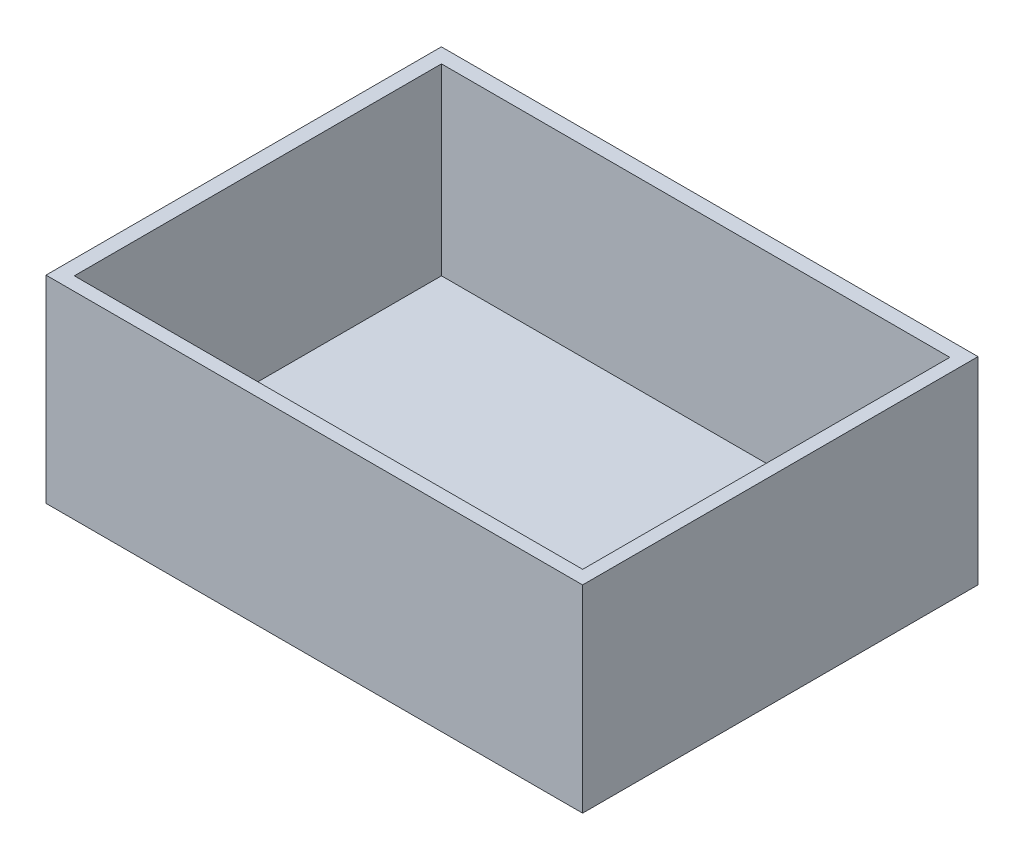
ISO-10303-21;
HEADER;
FILE_DESCRIPTION(('STEP AP214'),'2;1');
FILE_NAME('part.step','',(''),(''),'','','');
FILE_SCHEMA(('AUTOMOTIVE_DESIGN { 1 0 10303 214 1 1 1 1 }'));
ENDSEC;
DATA;
#1=APPLICATION_CONTEXT('core data for automotive mechanical design processes');
#2=APPLICATION_PROTOCOL_DEFINITION('international standard','automotive_design',2000,#1);
#3=PRODUCT_CONTEXT('',#1,'mechanical');
#4=PRODUCT('Part','Part','',(#3));
#5=PRODUCT_RELATED_PRODUCT_CATEGORY('part','',(#4));
#6=PRODUCT_DEFINITION_FORMATION('','',#4);
#7=PRODUCT_DEFINITION_CONTEXT('part definition',#1,'design');
#8=PRODUCT_DEFINITION('design','',#6,#7);
#9=PRODUCT_DEFINITION_SHAPE('','',#8);
#10=(LENGTH_UNIT() NAMED_UNIT(*) SI_UNIT(.MILLI.,.METRE.));
#11=(NAMED_UNIT(*) PLANE_ANGLE_UNIT() SI_UNIT($,.RADIAN.));
#12=(NAMED_UNIT(*) SI_UNIT($,.STERADIAN.) SOLID_ANGLE_UNIT());
#13=UNCERTAINTY_MEASURE_WITH_UNIT(LENGTH_MEASURE(1.E-05),#10,'distance_accuracy_value','');
#14=(GEOMETRIC_REPRESENTATION_CONTEXT(3) GLOBAL_UNCERTAINTY_ASSIGNED_CONTEXT((#13)) GLOBAL_UNIT_ASSIGNED_CONTEXT((#10,
#11,#12)) REPRESENTATION_CONTEXT('',''));
#15=CARTESIAN_POINT('',(0.,0.,0.));
#16=DIRECTION('',(0.,0.,1.));
#17=DIRECTION('',(1.,0.,0.));
#18=AXIS2_PLACEMENT_3D('',#15,#16,#17);
#19=CARTESIAN_POINT('',(-61.7894736842105,70.,-61.8947368421053));
#20=DIRECTION('',(1.,0.,0.));
#21=DIRECTION('',(0.,0.,-1.));
#22=AXIS2_PLACEMENT_3D('',#19,#20,#21);
#23=PLANE('',#22);
#24=DIRECTION('',(0.,0.,1.));
#25=VECTOR('',#24,1.);
#26=CARTESIAN_POINT('',(-61.7894736842105,0.,-61.8947368421053));
#27=LINE('',#26,#25);
#28=CARTESIAN_POINT('',(-61.7894736842105,0.,-61.8947368421053));
#29=VERTEX_POINT('',#28);
#30=CARTESIAN_POINT('',(-61.7894736842105,0.,78.1052631578947));
#31=VERTEX_POINT('',#30);
#32=EDGE_CURVE('E145',#29,#31,#27,.T.);
#33=ORIENTED_EDGE('',*,*,#32,.T.);
#34=DIRECTION('',(0.,-1.,0.));
#35=VECTOR('',#34,1.);
#36=CARTESIAN_POINT('',(-61.7894736842105,70.,78.1052631578947));
#37=LINE('',#36,#35);
#38=CARTESIAN_POINT('',(-61.7894736842105,70.,78.1052631578947));
#39=VERTEX_POINT('',#38);
#40=EDGE_CURVE('E11',#39,#31,#37,.T.);
#41=ORIENTED_EDGE('',*,*,#40,.F.);
#42=DIRECTION('',(0.,0.,1.));
#43=VECTOR('',#42,1.);
#44=CARTESIAN_POINT('',(-61.7894736842105,70.,-61.8947368421053));
#45=LINE('',#44,#43);
#46=CARTESIAN_POINT('',(-61.7894736842105,70.,-61.8947368421053));
#47=VERTEX_POINT('',#46);
#48=EDGE_CURVE('E149',#47,#39,#45,.T.);
#49=ORIENTED_EDGE('',*,*,#48,.F.);
#50=DIRECTION('',(0.,-1.,0.));
#51=VECTOR('',#50,1.);
#52=CARTESIAN_POINT('',(-61.7894736842105,70.,-61.8947368421053));
#53=LINE('',#52,#51);
#54=EDGE_CURVE('E155',#47,#29,#53,.T.);
#55=ORIENTED_EDGE('',*,*,#54,.T.);
#56=EDGE_LOOP('',(#33,#41,#49,#55));
#57=FACE_BOUND('',#56,.T.);
#58=ADVANCED_FACE('F37',(#57),#23,.F.);
#59=CARTESIAN_POINT('',(-61.7894736842105,70.,78.1052631578947));
#60=DIRECTION('',(0.,0.,-1.));
#61=DIRECTION('',(-1.,0.,0.));
#62=AXIS2_PLACEMENT_3D('',#59,#60,#61);
#63=PLANE('',#62);
#64=DIRECTION('',(1.,0.,0.));
#65=VECTOR('',#64,1.);
#66=CARTESIAN_POINT('',(-61.7894736842105,0.,78.1052631578947));
#67=LINE('',#66,#65);
#68=CARTESIAN_POINT('',(128.21052631579,0.,78.1052631578947));
#69=VERTEX_POINT('',#68);
#70=EDGE_CURVE('E158',#31,#69,#67,.T.);
#71=ORIENTED_EDGE('',*,*,#70,.T.);
#72=DIRECTION('',(0.,-1.,0.));
#73=VECTOR('',#72,1.);
#74=CARTESIAN_POINT('',(128.21052631579,70.,78.1052631578947));
#75=LINE('',#74,#73);
#76=CARTESIAN_POINT('',(128.21052631579,70.,78.1052631578947));
#77=VERTEX_POINT('',#76);
#78=EDGE_CURVE('E44',#77,#69,#75,.T.);
#79=ORIENTED_EDGE('',*,*,#78,.F.);
#80=DIRECTION('',(1.,0.,0.));
#81=VECTOR('',#80,1.);
#82=CARTESIAN_POINT('',(-61.7894736842105,70.,78.1052631578947));
#83=LINE('',#82,#81);
#84=EDGE_CURVE('E88',#39,#77,#83,.T.);
#85=ORIENTED_EDGE('',*,*,#84,.F.);
#86=ORIENTED_EDGE('',*,*,#40,.T.);
#87=EDGE_LOOP('',(#71,#79,#85,#86));
#88=FACE_BOUND('',#87,.T.);
#89=ADVANCED_FACE('F187',(#88),#63,.F.);
#90=CARTESIAN_POINT('',(128.21052631579,70.,-61.8947368421053));
#91=DIRECTION('',(-1.,0.,0.));
#92=DIRECTION('',(0.,0.,1.));
#93=AXIS2_PLACEMENT_3D('',#90,#91,#92);
#94=PLANE('',#93);
#95=DIRECTION('',(0.,0.,-1.));
#96=VECTOR('',#95,1.);
#97=CARTESIAN_POINT('',(128.21052631579,0.,-61.8947368421053));
#98=LINE('',#97,#96);
#99=CARTESIAN_POINT('',(128.21052631579,0.,-61.8947368421053));
#100=VERTEX_POINT('',#99);
#101=EDGE_CURVE('E160',#69,#100,#98,.T.);
#102=ORIENTED_EDGE('',*,*,#101,.T.);
#103=DIRECTION('',(0.,-1.,0.));
#104=VECTOR('',#103,1.);
#105=CARTESIAN_POINT('',(128.21052631579,70.,-61.8947368421053));
#106=LINE('',#105,#104);
#107=CARTESIAN_POINT('',(128.21052631579,70.,-61.8947368421053));
#108=VERTEX_POINT('',#107);
#109=EDGE_CURVE('E164',#108,#100,#106,.T.);
#110=ORIENTED_EDGE('',*,*,#109,.F.);
#111=DIRECTION('',(0.,0.,-1.));
#112=VECTOR('',#111,1.);
#113=CARTESIAN_POINT('',(128.21052631579,70.,-61.8947368421053));
#114=LINE('',#113,#112);
#115=EDGE_CURVE('E152',#77,#108,#114,.T.);
#116=ORIENTED_EDGE('',*,*,#115,.F.);
#117=ORIENTED_EDGE('',*,*,#78,.T.);
#118=EDGE_LOOP('',(#102,#110,#116,#117));
#119=FACE_BOUND('',#118,.T.);
#120=ADVANCED_FACE('F169',(#119),#94,.F.);
#121=CARTESIAN_POINT('',(-61.7894736842105,70.,-61.8947368421053));
#122=DIRECTION('',(0.,0.,1.));
#123=DIRECTION('',(1.,0.,0.));
#124=AXIS2_PLACEMENT_3D('',#121,#122,#123);
#125=PLANE('',#124);
#126=DIRECTION('',(-1.,0.,0.));
#127=VECTOR('',#126,1.);
#128=CARTESIAN_POINT('',(-61.7894736842105,0.,-61.8947368421053));
#129=LINE('',#128,#127);
#130=EDGE_CURVE('E81',#100,#29,#129,.T.);
#131=ORIENTED_EDGE('',*,*,#130,.T.);
#132=ORIENTED_EDGE('',*,*,#54,.F.);
#133=DIRECTION('',(-1.,0.,0.));
#134=VECTOR('',#133,1.);
#135=CARTESIAN_POINT('',(-61.7894736842105,70.,-61.8947368421053));
#136=LINE('',#135,#134);
#137=EDGE_CURVE('E60',#108,#47,#136,.T.);
#138=ORIENTED_EDGE('',*,*,#137,.F.);
#139=ORIENTED_EDGE('',*,*,#109,.T.);
#140=EDGE_LOOP('',(#131,#132,#138,#139));
#141=FACE_BOUND('',#140,.T.);
#142=ADVANCED_FACE('F177',(#141),#125,.F.);
#143=CARTESIAN_POINT('',(0.,70.,0.));
#144=DIRECTION('',(0.,1.,0.));
#145=DIRECTION('',(0.,0.,1.));
#146=AXIS2_PLACEMENT_3D('',#143,#144,#145);
#147=PLANE('',#146);
#148=DIRECTION('',(0.,0.,1.));
#149=VECTOR('',#148,1.);
#150=CARTESIAN_POINT('',(-56.5545811256332,70.,-56.6885006136446));
#151=LINE('',#150,#149);
#152=CARTESIAN_POINT('',(-56.5545811256332,70.,-56.6885006136446));
#153=VERTEX_POINT('',#152);
#154=CARTESIAN_POINT('',(-56.5545811256332,70.,73.3114993863554));
#155=VERTEX_POINT('',#154);
#156=EDGE_CURVE('E51',#153,#155,#151,.T.);
#157=ORIENTED_EDGE('',*,*,#156,.F.);
#158=DIRECTION('',(-1.,0.,0.));
#159=VECTOR('',#158,1.);
#160=CARTESIAN_POINT('',(-56.5545811256332,70.,-56.6885006136446));
#161=LINE('',#160,#159);
#162=CARTESIAN_POINT('',(123.445418874367,70.,-56.6885006136446));
#163=VERTEX_POINT('',#162);
#164=EDGE_CURVE('E130',#163,#153,#161,.T.);
#165=ORIENTED_EDGE('',*,*,#164,.F.);
#166=DIRECTION('',(0.,0.,-1.));
#167=VECTOR('',#166,1.);
#168=CARTESIAN_POINT('',(123.445418874367,70.,-56.6885006136446));
#169=LINE('',#168,#167);
#170=CARTESIAN_POINT('',(123.445418874367,70.,73.3114993863554));
#171=VERTEX_POINT('',#170);
#172=EDGE_CURVE('E133',#171,#163,#169,.T.);
#173=ORIENTED_EDGE('',*,*,#172,.F.);
#174=DIRECTION('',(1.,0.,0.));
#175=VECTOR('',#174,1.);
#176=CARTESIAN_POINT('',(-56.5545811256332,70.,73.3114993863554));
#177=LINE('',#176,#175);
#178=EDGE_CURVE('E139',#155,#171,#177,.T.);
#179=ORIENTED_EDGE('',*,*,#178,.F.);
#180=EDGE_LOOP('',(#157,#165,#173,#179));
#181=FACE_BOUND('',#180,.T.);
#182=ORIENTED_EDGE('',*,*,#48,.T.);
#183=ORIENTED_EDGE('',*,*,#84,.T.);
#184=ORIENTED_EDGE('',*,*,#115,.T.);
#185=ORIENTED_EDGE('',*,*,#137,.T.);
#186=EDGE_LOOP('',(#182,#183,#184,#185));
#187=FACE_BOUND('',#186,.T.);
#188=ADVANCED_FACE('F179',(#181,#187),#147,.T.);
#189=CARTESIAN_POINT('',(0.,0.,0.));
#190=DIRECTION('',(0.,1.,0.));
#191=DIRECTION('',(0.,0.,1.));
#192=AXIS2_PLACEMENT_3D('',#189,#190,#191);
#193=PLANE('',#192);
#194=ORIENTED_EDGE('',*,*,#32,.F.);
#195=ORIENTED_EDGE('',*,*,#130,.F.);
#196=ORIENTED_EDGE('',*,*,#101,.F.);
#197=ORIENTED_EDGE('',*,*,#70,.F.);
#198=EDGE_LOOP('',(#194,#195,#196,#197));
#199=FACE_BOUND('',#198,.T.);
#200=ADVANCED_FACE('F173',(#199),#193,.F.);
#201=CARTESIAN_POINT('',(-56.5545811256332,5.,-56.6885006136446));
#202=DIRECTION('',(-1.,0.,0.));
#203=DIRECTION('',(0.,0.,1.));
#204=AXIS2_PLACEMENT_3D('',#201,#202,#203);
#205=PLANE('',#204);
#206=ORIENTED_EDGE('',*,*,#156,.T.);
#207=DIRECTION('',(0.,1.,0.));
#208=VECTOR('',#207,1.);
#209=CARTESIAN_POINT('',(-56.5545811256332,5.,73.3114993863554));
#210=LINE('',#209,#208);
#211=CARTESIAN_POINT('',(-56.5545811256332,5.,73.3114993863554));
#212=VERTEX_POINT('',#211);
#213=EDGE_CURVE('E108',#212,#155,#210,.T.);
#214=ORIENTED_EDGE('',*,*,#213,.F.);
#215=DIRECTION('',(0.,0.,1.));
#216=VECTOR('',#215,1.);
#217=CARTESIAN_POINT('',(-56.5545811256332,5.,-56.6885006136446));
#218=LINE('',#217,#216);
#219=CARTESIAN_POINT('',(-56.5545811256332,5.,-56.6885006136446));
#220=VERTEX_POINT('',#219);
#221=EDGE_CURVE('E112',#220,#212,#218,.T.);
#222=ORIENTED_EDGE('',*,*,#221,.F.);
#223=DIRECTION('',(0.,1.,0.));
#224=VECTOR('',#223,1.);
#225=CARTESIAN_POINT('',(-56.5545811256332,5.,-56.6885006136446));
#226=LINE('',#225,#224);
#227=EDGE_CURVE('E143',#220,#153,#226,.T.);
#228=ORIENTED_EDGE('',*,*,#227,.T.);
#229=EDGE_LOOP('',(#206,#214,#222,#228));
#230=FACE_BOUND('',#229,.T.);
#231=ADVANCED_FACE('F110',(#230),#205,.F.);
#232=CARTESIAN_POINT('',(-56.5545811256332,5.,-56.6885006136446));
#233=DIRECTION('',(0.,0.,-1.));
#234=DIRECTION('',(-1.,0.,0.));
#235=AXIS2_PLACEMENT_3D('',#232,#233,#234);
#236=PLANE('',#235);
#237=ORIENTED_EDGE('',*,*,#164,.T.);
#238=ORIENTED_EDGE('',*,*,#227,.F.);
#239=DIRECTION('',(-1.,0.,0.));
#240=VECTOR('',#239,1.);
#241=CARTESIAN_POINT('',(-56.5545811256332,5.,-56.6885006136446));
#242=LINE('',#241,#240);
#243=CARTESIAN_POINT('',(123.445418874367,5.,-56.6885006136446));
#244=VERTEX_POINT('',#243);
#245=EDGE_CURVE('E118',#244,#220,#242,.T.);
#246=ORIENTED_EDGE('',*,*,#245,.F.);
#247=DIRECTION('',(0.,1.,0.));
#248=VECTOR('',#247,1.);
#249=CARTESIAN_POINT('',(123.445418874367,5.,-56.6885006136446));
#250=LINE('',#249,#248);
#251=EDGE_CURVE('E146',#244,#163,#250,.T.);
#252=ORIENTED_EDGE('',*,*,#251,.T.);
#253=EDGE_LOOP('',(#237,#238,#246,#252));
#254=FACE_BOUND('',#253,.T.);
#255=ADVANCED_FACE('F230',(#254),#236,.F.);
#256=CARTESIAN_POINT('',(123.445418874367,5.,-56.6885006136446));
#257=DIRECTION('',(1.,0.,0.));
#258=DIRECTION('',(0.,0.,-1.));
#259=AXIS2_PLACEMENT_3D('',#256,#257,#258);
#260=PLANE('',#259);
#261=ORIENTED_EDGE('',*,*,#172,.T.);
#262=ORIENTED_EDGE('',*,*,#251,.F.);
#263=DIRECTION('',(0.,0.,-1.));
#264=VECTOR('',#263,1.);
#265=CARTESIAN_POINT('',(123.445418874367,5.,-56.6885006136446));
#266=LINE('',#265,#264);
#267=CARTESIAN_POINT('',(123.445418874367,5.,73.3114993863554));
#268=VERTEX_POINT('',#267);
#269=EDGE_CURVE('E126',#268,#244,#266,.T.);
#270=ORIENTED_EDGE('',*,*,#269,.F.);
#271=DIRECTION('',(0.,1.,0.));
#272=VECTOR('',#271,1.);
#273=CARTESIAN_POINT('',(123.445418874367,5.,73.3114993863554));
#274=LINE('',#273,#272);
#275=EDGE_CURVE('E117',#268,#171,#274,.T.);
#276=ORIENTED_EDGE('',*,*,#275,.T.);
#277=EDGE_LOOP('',(#261,#262,#270,#276));
#278=FACE_BOUND('',#277,.T.);
#279=ADVANCED_FACE('F240',(#278),#260,.F.);
#280=CARTESIAN_POINT('',(-56.5545811256332,5.,73.3114993863554));
#281=DIRECTION('',(0.,0.,1.));
#282=DIRECTION('',(1.,0.,0.));
#283=AXIS2_PLACEMENT_3D('',#280,#281,#282);
#284=PLANE('',#283);
#285=ORIENTED_EDGE('',*,*,#178,.T.);
#286=ORIENTED_EDGE('',*,*,#275,.F.);
#287=DIRECTION('',(1.,0.,0.));
#288=VECTOR('',#287,1.);
#289=CARTESIAN_POINT('',(-56.5545811256332,5.,73.3114993863554));
#290=LINE('',#289,#288);
#291=EDGE_CURVE('E121',#212,#268,#290,.T.);
#292=ORIENTED_EDGE('',*,*,#291,.F.);
#293=ORIENTED_EDGE('',*,*,#213,.T.);
#294=EDGE_LOOP('',(#285,#286,#292,#293));
#295=FACE_BOUND('',#294,.T.);
#296=ADVANCED_FACE('F122',(#295),#284,.F.);
#297=CARTESIAN_POINT('',(0.,5.,0.));
#298=DIRECTION('',(0.,1.,0.));
#299=DIRECTION('',(0.,0.,1.));
#300=AXIS2_PLACEMENT_3D('',#297,#298,#299);
#301=PLANE('',#300);
#302=ORIENTED_EDGE('',*,*,#221,.T.);
#303=ORIENTED_EDGE('',*,*,#291,.T.);
#304=ORIENTED_EDGE('',*,*,#269,.T.);
#305=ORIENTED_EDGE('',*,*,#245,.T.);
#306=EDGE_LOOP('',(#302,#303,#304,#305));
#307=FACE_BOUND('',#306,.T.);
#308=ADVANCED_FACE('F128',(#307),#301,.T.);
#309=CLOSED_SHELL('',(#58,#89,#120,#142,#188,#200,#231,#255,#279,#296,#308));
#310=MANIFOLD_SOLID_BREP('B2',#309);
#311=ADVANCED_BREP_SHAPE_REPRESENTATION('',(#18,#310),#14);
#312=SHAPE_DEFINITION_REPRESENTATION(#9,#311);
ENDSEC;
END-ISO-10303-21;
